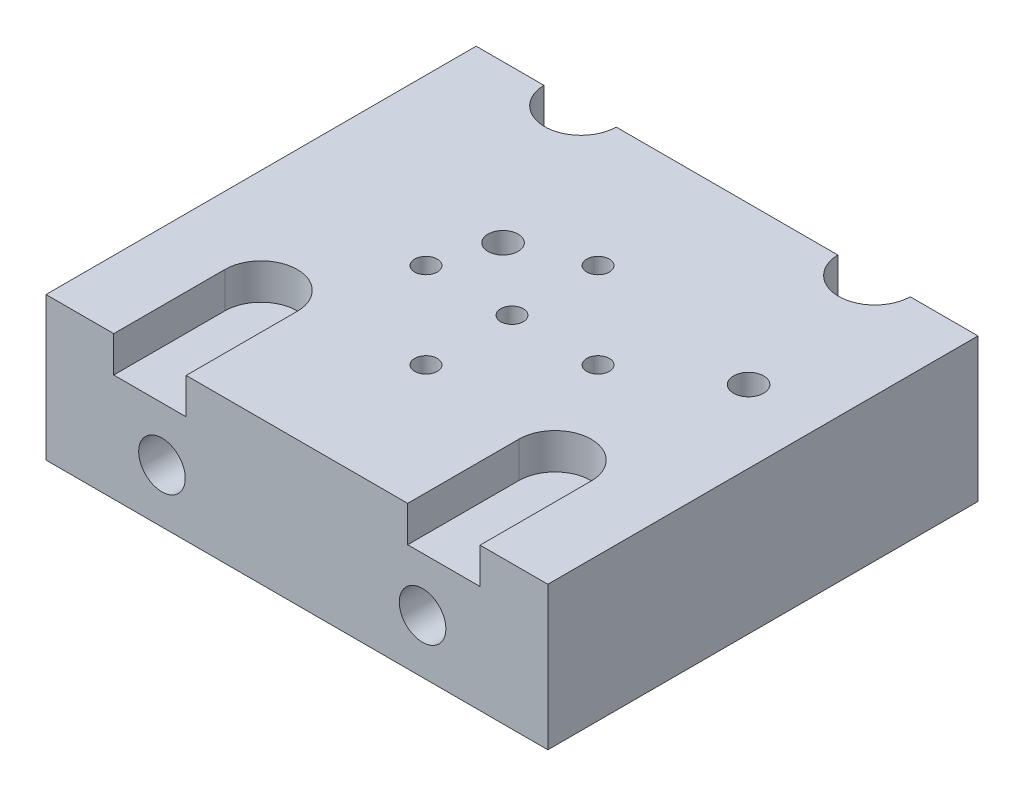
ISO-10303-21;
HEADER;
FILE_DESCRIPTION(('STEP AP214'),'2;1');
FILE_NAME('part.step','',(''),(''),'','','');
FILE_SCHEMA(('AUTOMOTIVE_DESIGN { 1 0 10303 214 1 1 1 1 }'));
ENDSEC;
DATA;
#1=APPLICATION_CONTEXT('core data for automotive mechanical design processes');
#2=APPLICATION_PROTOCOL_DEFINITION('international standard','automotive_design',2000,#1);
#3=PRODUCT_CONTEXT('',#1,'mechanical');
#4=PRODUCT('Part','Part','',(#3));
#5=PRODUCT_RELATED_PRODUCT_CATEGORY('part','',(#4));
#6=PRODUCT_DEFINITION_FORMATION('','',#4);
#7=PRODUCT_DEFINITION_CONTEXT('part definition',#1,'design');
#8=PRODUCT_DEFINITION('design','',#6,#7);
#9=PRODUCT_DEFINITION_SHAPE('','',#8);
#10=(LENGTH_UNIT() NAMED_UNIT(*) SI_UNIT(.MILLI.,.METRE.));
#11=(NAMED_UNIT(*) PLANE_ANGLE_UNIT() SI_UNIT($,.RADIAN.));
#12=(NAMED_UNIT(*) SI_UNIT($,.STERADIAN.) SOLID_ANGLE_UNIT());
#13=UNCERTAINTY_MEASURE_WITH_UNIT(LENGTH_MEASURE(1.E-05),#10,'distance_accuracy_value','');
#14=(GEOMETRIC_REPRESENTATION_CONTEXT(3) GLOBAL_UNCERTAINTY_ASSIGNED_CONTEXT((#13)) GLOBAL_UNIT_ASSIGNED_CONTEXT((#10,
#11,#12)) REPRESENTATION_CONTEXT('',''));
#15=CARTESIAN_POINT('',(0.,0.,0.));
#16=DIRECTION('',(0.,0.,1.));
#17=DIRECTION('',(1.,0.,0.));
#18=AXIS2_PLACEMENT_3D('',#15,#16,#17);
#19=CARTESIAN_POINT('',(35.,0.,30.));
#20=DIRECTION('',(0.,1.,0.));
#21=DIRECTION('',(0.,0.,1.));
#22=AXIS2_PLACEMENT_3D('',#19,#20,#21);
#23=CYLINDRICAL_SURFACE('',#22,1.575);
#24=CARTESIAN_POINT('',(35.,20.,30.));
#25=DIRECTION('',(0.,1.,0.));
#26=DIRECTION('',(0.,0.,1.));
#27=AXIS2_PLACEMENT_3D('',#24,#25,#26);
#28=CIRCLE('',#27,1.575);
#29=CARTESIAN_POINT('',(35.,20.,31.575));
#30=VERTEX_POINT('',#29);
#31=EDGE_CURVE('E296',#30,#30,#28,.T.);
#32=ORIENTED_EDGE('',*,*,#31,.T.);
#33=EDGE_LOOP('',(#32));
#34=FACE_BOUND('',#33,.T.);
#35=CARTESIAN_POINT('',(35.,3.,30.));
#36=DIRECTION('',(0.,-1.,0.));
#37=DIRECTION('',(0.,0.,-1.));
#38=AXIS2_PLACEMENT_3D('',#35,#36,#37);
#39=CIRCLE('',#38,1.575);
#40=CARTESIAN_POINT('',(35.,3.,28.425));
#41=VERTEX_POINT('',#40);
#42=EDGE_CURVE('E274',#41,#41,#39,.F.);
#43=ORIENTED_EDGE('',*,*,#42,.F.);
#44=EDGE_LOOP('',(#43));
#45=FACE_BOUND('',#44,.T.);
#46=ADVANCED_FACE('F47',(#34,#45),#23,.F.);
#47=CARTESIAN_POINT('',(23.,0.,30.));
#48=DIRECTION('',(0.,1.,0.));
#49=DIRECTION('',(0.,0.,1.));
#50=AXIS2_PLACEMENT_3D('',#47,#48,#49);
#51=CYLINDRICAL_SURFACE('',#50,1.575);
#52=CARTESIAN_POINT('',(23.,20.,30.));
#53=DIRECTION('',(0.,1.,0.));
#54=DIRECTION('',(0.,0.,1.));
#55=AXIS2_PLACEMENT_3D('',#52,#53,#54);
#56=CIRCLE('',#55,1.575);
#57=CARTESIAN_POINT('',(23.,20.,31.575));
#58=VERTEX_POINT('',#57);
#59=EDGE_CURVE('E278',#58,#58,#56,.T.);
#60=ORIENTED_EDGE('',*,*,#59,.T.);
#61=EDGE_LOOP('',(#60));
#62=FACE_BOUND('',#61,.T.);
#63=CARTESIAN_POINT('',(23.,3.,30.));
#64=DIRECTION('',(0.,-1.,0.));
#65=DIRECTION('',(0.,0.,-1.));
#66=AXIS2_PLACEMENT_3D('',#63,#64,#65);
#67=CIRCLE('',#66,1.575);
#68=CARTESIAN_POINT('',(23.,3.,28.425));
#69=VERTEX_POINT('',#68);
#70=EDGE_CURVE('E345',#69,#69,#67,.F.);
#71=ORIENTED_EDGE('',*,*,#70,.F.);
#72=EDGE_LOOP('',(#71));
#73=FACE_BOUND('',#72,.T.);
#74=ADVANCED_FACE('F424',(#62,#73),#51,.F.);
#75=CARTESIAN_POINT('',(35.,0.,42.));
#76=DIRECTION('',(0.,1.,0.));
#77=DIRECTION('',(0.,0.,1.));
#78=AXIS2_PLACEMENT_3D('',#75,#76,#77);
#79=CYLINDRICAL_SURFACE('',#78,1.57499999999999);
#80=CARTESIAN_POINT('',(35.,20.,42.));
#81=DIRECTION('',(0.,1.,0.));
#82=DIRECTION('',(0.,0.,1.));
#83=AXIS2_PLACEMENT_3D('',#80,#81,#82);
#84=CIRCLE('',#83,1.57499999999999);
#85=CARTESIAN_POINT('',(35.,20.,43.575));
#86=VERTEX_POINT('',#85);
#87=EDGE_CURVE('E287',#86,#86,#84,.T.);
#88=ORIENTED_EDGE('',*,*,#87,.T.);
#89=EDGE_LOOP('',(#88));
#90=FACE_BOUND('',#89,.T.);
#91=CARTESIAN_POINT('',(35.,3.,42.));
#92=DIRECTION('',(0.,-1.,0.));
#93=DIRECTION('',(0.,0.,-1.));
#94=AXIS2_PLACEMENT_3D('',#91,#92,#93);
#95=CIRCLE('',#94,1.57499999999999);
#96=CARTESIAN_POINT('',(35.,3.,40.425));
#97=VERTEX_POINT('',#96);
#98=EDGE_CURVE('E342',#97,#97,#95,.F.);
#99=ORIENTED_EDGE('',*,*,#98,.F.);
#100=EDGE_LOOP('',(#99));
#101=FACE_BOUND('',#100,.T.);
#102=ADVANCED_FACE('F431',(#90,#101),#79,.F.);
#103=CARTESIAN_POINT('',(47.,0.,30.));
#104=DIRECTION('',(0.,1.,0.));
#105=DIRECTION('',(0.,0.,1.));
#106=AXIS2_PLACEMENT_3D('',#103,#104,#105);
#107=CYLINDRICAL_SURFACE('',#106,1.575);
#108=CARTESIAN_POINT('',(47.,20.,30.));
#109=DIRECTION('',(0.,1.,0.));
#110=DIRECTION('',(0.,0.,1.));
#111=AXIS2_PLACEMENT_3D('',#108,#109,#110);
#112=CIRCLE('',#111,1.575);
#113=CARTESIAN_POINT('',(47.,20.,31.575));
#114=VERTEX_POINT('',#113);
#115=EDGE_CURVE('E290',#114,#114,#112,.T.);
#116=ORIENTED_EDGE('',*,*,#115,.T.);
#117=EDGE_LOOP('',(#116));
#118=FACE_BOUND('',#117,.T.);
#119=CARTESIAN_POINT('',(47.,3.,30.));
#120=DIRECTION('',(0.,-1.,0.));
#121=DIRECTION('',(0.,0.,-1.));
#122=AXIS2_PLACEMENT_3D('',#119,#120,#121);
#123=CIRCLE('',#122,1.575);
#124=CARTESIAN_POINT('',(47.,3.,28.425));
#125=VERTEX_POINT('',#124);
#126=EDGE_CURVE('E339',#125,#125,#123,.F.);
#127=ORIENTED_EDGE('',*,*,#126,.F.);
#128=EDGE_LOOP('',(#127));
#129=FACE_BOUND('',#128,.T.);
#130=ADVANCED_FACE('F437',(#118,#129),#107,.F.);
#131=CARTESIAN_POINT('',(35.,0.,18.));
#132=DIRECTION('',(0.,1.,0.));
#133=DIRECTION('',(0.,0.,1.));
#134=AXIS2_PLACEMENT_3D('',#131,#132,#133);
#135=CYLINDRICAL_SURFACE('',#134,1.575);
#136=CARTESIAN_POINT('',(35.,20.,18.));
#137=DIRECTION('',(0.,1.,0.));
#138=DIRECTION('',(0.,0.,1.));
#139=AXIS2_PLACEMENT_3D('',#136,#137,#138);
#140=CIRCLE('',#139,1.575);
#141=CARTESIAN_POINT('',(35.,20.,19.575));
#142=VERTEX_POINT('',#141);
#143=EDGE_CURVE('E293',#142,#142,#140,.T.);
#144=ORIENTED_EDGE('',*,*,#143,.T.);
#145=EDGE_LOOP('',(#144));
#146=FACE_BOUND('',#145,.T.);
#147=CARTESIAN_POINT('',(35.,3.,18.));
#148=DIRECTION('',(0.,-1.,0.));
#149=DIRECTION('',(0.,0.,-1.));
#150=AXIS2_PLACEMENT_3D('',#147,#148,#149);
#151=CIRCLE('',#150,1.575);
#152=CARTESIAN_POINT('',(35.,3.,16.425));
#153=VERTEX_POINT('',#152);
#154=EDGE_CURVE('E240',#153,#153,#151,.F.);
#155=ORIENTED_EDGE('',*,*,#154,.F.);
#156=EDGE_LOOP('',(#155));
#157=FACE_BOUND('',#156,.T.);
#158=ADVANCED_FACE('F455',(#146,#157),#135,.F.);
#159=CARTESIAN_POINT('',(0.,20.,0.));
#160=DIRECTION('',(1.,0.,0.));
#161=DIRECTION('',(0.,0.,-1.));
#162=AXIS2_PLACEMENT_3D('',#159,#160,#161);
#163=PLANE('',#162);
#164=DIRECTION('',(0.,0.,1.));
#165=VECTOR('',#164,1.);
#166=CARTESIAN_POINT('',(0.,0.,0.));
#167=LINE('',#166,#165);
#168=CARTESIAN_POINT('',(0.,0.,0.));
#169=VERTEX_POINT('',#168);
#170=CARTESIAN_POINT('',(0.,0.,60.));
#171=VERTEX_POINT('',#170);
#172=EDGE_CURVE('E301',#169,#171,#167,.T.);
#173=ORIENTED_EDGE('',*,*,#172,.T.);
#174=DIRECTION('',(0.,-1.,0.));
#175=VECTOR('',#174,1.);
#176=CARTESIAN_POINT('',(0.,20.,60.));
#177=LINE('',#176,#175);
#178=CARTESIAN_POINT('',(0.,20.,60.));
#179=VERTEX_POINT('',#178);
#180=EDGE_CURVE('E333',#179,#171,#177,.T.);
#181=ORIENTED_EDGE('',*,*,#180,.F.);
#182=DIRECTION('',(0.,0.,1.));
#183=VECTOR('',#182,1.);
#184=CARTESIAN_POINT('',(0.,20.,0.));
#185=LINE('',#184,#183);
#186=CARTESIAN_POINT('',(0.,20.,0.));
#187=VERTEX_POINT('',#186);
#188=EDGE_CURVE('E302',#187,#179,#185,.T.);
#189=ORIENTED_EDGE('',*,*,#188,.F.);
#190=DIRECTION('',(0.,-1.,0.));
#191=VECTOR('',#190,1.);
#192=CARTESIAN_POINT('',(0.,20.,0.));
#193=LINE('',#192,#191);
#194=EDGE_CURVE('E316',#187,#169,#193,.T.);
#195=ORIENTED_EDGE('',*,*,#194,.T.);
#196=EDGE_LOOP('',(#173,#181,#189,#195));
#197=FACE_BOUND('',#196,.T.);
#198=ADVANCED_FACE('F404',(#197),#163,.F.);
#199=CARTESIAN_POINT('',(0.,20.,60.));
#200=DIRECTION('',(0.,0.,-1.));
#201=DIRECTION('',(-1.,0.,0.));
#202=AXIS2_PLACEMENT_3D('',#199,#200,#201);
#203=PLANE('',#202);
#204=CARTESIAN_POINT('',(52.525,7.5,60.));
#205=DIRECTION('',(0.,0.,-1.));
#206=DIRECTION('',(-1.,0.,0.));
#207=AXIS2_PLACEMENT_3D('',#204,#205,#206);
#208=CIRCLE('',#207,3.25);
#209=CARTESIAN_POINT('',(49.275,7.5,60.));
#210=VERTEX_POINT('',#209);
#211=EDGE_CURVE('E267',#210,#210,#208,.T.);
#212=ORIENTED_EDGE('',*,*,#211,.T.);
#213=EDGE_LOOP('',(#212));
#214=FACE_BOUND('',#213,.T.);
#215=CARTESIAN_POINT('',(16.175,7.5,60.));
#216=DIRECTION('',(0.,0.,-1.));
#217=DIRECTION('',(-1.,0.,0.));
#218=AXIS2_PLACEMENT_3D('',#215,#216,#217);
#219=CIRCLE('',#218,3.25);
#220=CARTESIAN_POINT('',(12.925,7.5,60.));
#221=VERTEX_POINT('',#220);
#222=EDGE_CURVE('E271',#221,#221,#219,.T.);
#223=ORIENTED_EDGE('',*,*,#222,.T.);
#224=EDGE_LOOP('',(#223));
#225=FACE_BOUND('',#224,.T.);
#226=DIRECTION('',(-1.,0.,0.));
#227=VECTOR('',#226,1.);
#228=CARTESIAN_POINT('',(0.,15.,60.));
#229=LINE('',#228,#227);
#230=CARTESIAN_POINT('',(60.55,15.,60.));
#231=VERTEX_POINT('',#230);
#232=CARTESIAN_POINT('',(50.45,15.,60.));
#233=VERTEX_POINT('',#232);
#234=EDGE_CURVE('E12',#231,#233,#229,.T.);
#235=ORIENTED_EDGE('',*,*,#234,.T.);
#236=DIRECTION('',(0.,1.,0.));
#237=VECTOR('',#236,1.);
#238=CARTESIAN_POINT('',(50.45,20.,60.));
#239=LINE('',#238,#237);
#240=CARTESIAN_POINT('',(50.45,20.,60.));
#241=VERTEX_POINT('',#240);
#242=EDGE_CURVE('E230',#233,#241,#239,.T.);
#243=ORIENTED_EDGE('',*,*,#242,.T.);
#244=DIRECTION('',(1.,0.,0.));
#245=VECTOR('',#244,1.);
#246=CARTESIAN_POINT('',(0.,20.,60.));
#247=LINE('',#246,#245);
#248=CARTESIAN_POINT('',(19.55,20.,60.));
#249=VERTEX_POINT('',#248);
#250=EDGE_CURVE('E190',#249,#241,#247,.T.);
#251=ORIENTED_EDGE('',*,*,#250,.F.);
#252=DIRECTION('',(0.,-1.,0.));
#253=VECTOR('',#252,1.);
#254=CARTESIAN_POINT('',(19.55,20.,60.));
#255=LINE('',#254,#253);
#256=CARTESIAN_POINT('',(19.55,15.,60.));
#257=VERTEX_POINT('',#256);
#258=EDGE_CURVE('E215',#249,#257,#255,.T.);
#259=ORIENTED_EDGE('',*,*,#258,.T.);
#260=DIRECTION('',(1.,0.,0.));
#261=VECTOR('',#260,1.);
#262=CARTESIAN_POINT('',(0.,15.,60.));
#263=LINE('',#262,#261);
#264=CARTESIAN_POINT('',(9.45000000000001,15.,60.));
#265=VERTEX_POINT('',#264);
#266=EDGE_CURVE('E56',#265,#257,#263,.T.);
#267=ORIENTED_EDGE('',*,*,#266,.F.);
#268=DIRECTION('',(0.,1.,0.));
#269=VECTOR('',#268,1.);
#270=CARTESIAN_POINT('',(9.45000000000001,20.,60.));
#271=LINE('',#270,#269);
#272=CARTESIAN_POINT('',(9.45000000000001,20.,60.));
#273=VERTEX_POINT('',#272);
#274=EDGE_CURVE('E220',#265,#273,#271,.T.);
#275=ORIENTED_EDGE('',*,*,#274,.T.);
#276=EDGE_CURVE('E307',#179,#273,#247,.T.);
#277=ORIENTED_EDGE('',*,*,#276,.F.);
#278=ORIENTED_EDGE('',*,*,#180,.T.);
#279=DIRECTION('',(1.,0.,0.));
#280=VECTOR('',#279,1.);
#281=CARTESIAN_POINT('',(0.,0.,60.));
#282=LINE('',#281,#280);
#283=CARTESIAN_POINT('',(70.,0.,60.));
#284=VERTEX_POINT('',#283);
#285=EDGE_CURVE('E320',#171,#284,#282,.T.);
#286=ORIENTED_EDGE('',*,*,#285,.T.);
#287=DIRECTION('',(0.,-1.,0.));
#288=VECTOR('',#287,1.);
#289=CARTESIAN_POINT('',(70.,20.,60.));
#290=LINE('',#289,#288);
#291=CARTESIAN_POINT('',(70.,20.,60.));
#292=VERTEX_POINT('',#291);
#293=EDGE_CURVE('E330',#292,#284,#290,.T.);
#294=ORIENTED_EDGE('',*,*,#293,.F.);
#295=CARTESIAN_POINT('',(60.55,20.,60.));
#296=VERTEX_POINT('',#295);
#297=EDGE_CURVE('E305',#296,#292,#247,.T.);
#298=ORIENTED_EDGE('',*,*,#297,.F.);
#299=DIRECTION('',(0.,-1.,0.));
#300=VECTOR('',#299,1.);
#301=CARTESIAN_POINT('',(60.55,20.,60.));
#302=LINE('',#301,#300);
#303=EDGE_CURVE('E227',#296,#231,#302,.T.);
#304=ORIENTED_EDGE('',*,*,#303,.T.);
#305=EDGE_LOOP('',(#235,#243,#251,#259,#267,#275,#277,#278,#286,#294,#298,#304));
#306=FACE_BOUND('',#305,.T.);
#307=ADVANCED_FACE('F381',(#214,#225,#306),#203,.F.);
#308=CARTESIAN_POINT('',(70.,20.,0.));
#309=DIRECTION('',(-1.,0.,0.));
#310=DIRECTION('',(0.,0.,1.));
#311=AXIS2_PLACEMENT_3D('',#308,#309,#310);
#312=PLANE('',#311);
#313=DIRECTION('',(0.,0.,-1.));
#314=VECTOR('',#313,1.);
#315=CARTESIAN_POINT('',(70.,0.,0.));
#316=LINE('',#315,#314);
#317=CARTESIAN_POINT('',(70.,0.,0.));
#318=VERTEX_POINT('',#317);
#319=EDGE_CURVE('E322',#284,#318,#316,.T.);
#320=ORIENTED_EDGE('',*,*,#319,.T.);
#321=DIRECTION('',(0.,-1.,0.));
#322=VECTOR('',#321,1.);
#323=CARTESIAN_POINT('',(70.,20.,0.));
#324=LINE('',#323,#322);
#325=CARTESIAN_POINT('',(70.,20.,0.));
#326=VERTEX_POINT('',#325);
#327=EDGE_CURVE('E327',#326,#318,#324,.T.);
#328=ORIENTED_EDGE('',*,*,#327,.F.);
#329=DIRECTION('',(0.,0.,-1.));
#330=VECTOR('',#329,1.);
#331=CARTESIAN_POINT('',(70.,20.,0.));
#332=LINE('',#331,#330);
#333=EDGE_CURVE('E310',#292,#326,#332,.T.);
#334=ORIENTED_EDGE('',*,*,#333,.F.);
#335=ORIENTED_EDGE('',*,*,#293,.T.);
#336=EDGE_LOOP('',(#320,#328,#334,#335));
#337=FACE_BOUND('',#336,.T.);
#338=ADVANCED_FACE('F388',(#337),#312,.F.);
#339=CARTESIAN_POINT('',(0.,20.,0.));
#340=DIRECTION('',(0.,0.,1.));
#341=DIRECTION('',(1.,0.,0.));
#342=AXIS2_PLACEMENT_3D('',#339,#340,#341);
#343=PLANE('',#342);
#344=CARTESIAN_POINT('',(52.525,7.5,0.));
#345=DIRECTION('',(0.,0.,1.));
#346=DIRECTION('',(1.,0.,0.));
#347=AXIS2_PLACEMENT_3D('',#344,#345,#346);
#348=CIRCLE('',#347,4.05);
#349=CARTESIAN_POINT('',(56.575,7.5,0.));
#350=VERTEX_POINT('',#349);
#351=EDGE_CURVE('E355',#350,#350,#348,.T.);
#352=ORIENTED_EDGE('',*,*,#351,.T.);
#353=EDGE_LOOP('',(#352));
#354=FACE_BOUND('',#353,.T.);
#355=CARTESIAN_POINT('',(16.175,7.5,0.));
#356=DIRECTION('',(0.,0.,1.));
#357=DIRECTION('',(1.,0.,0.));
#358=AXIS2_PLACEMENT_3D('',#355,#356,#357);
#359=CIRCLE('',#358,4.05);
#360=CARTESIAN_POINT('',(20.225,7.5,0.));
#361=VERTEX_POINT('',#360);
#362=EDGE_CURVE('E352',#361,#361,#359,.T.);
#363=ORIENTED_EDGE('',*,*,#362,.T.);
#364=EDGE_LOOP('',(#363));
#365=FACE_BOUND('',#364,.T.);
#366=DIRECTION('',(-1.,0.,0.));
#367=VECTOR('',#366,1.);
#368=CARTESIAN_POINT('',(0.,15.,0.));
#369=LINE('',#368,#367);
#370=CARTESIAN_POINT('',(19.5489093426721,15.,0.));
#371=VERTEX_POINT('',#370);
#372=CARTESIAN_POINT('',(9.45109065732797,15.,0.));
#373=VERTEX_POINT('',#372);
#374=EDGE_CURVE('E370',#371,#373,#369,.T.);
#375=ORIENTED_EDGE('',*,*,#374,.F.);
#376=DIRECTION('',(0.,1.,0.));
#377=VECTOR('',#376,1.);
#378=CARTESIAN_POINT('',(19.5489093426721,15.,0.));
#379=LINE('',#378,#377);
#380=CARTESIAN_POINT('',(19.5489093426721,20.,0.));
#381=VERTEX_POINT('',#380);
#382=EDGE_CURVE('E233',#371,#381,#379,.T.);
#383=ORIENTED_EDGE('',*,*,#382,.T.);
#384=DIRECTION('',(-1.,0.,0.));
#385=VECTOR('',#384,1.);
#386=CARTESIAN_POINT('',(0.,20.,0.));
#387=LINE('',#386,#385);
#388=CARTESIAN_POINT('',(50.451090657328,20.,0.));
#389=VERTEX_POINT('',#388);
#390=EDGE_CURVE('E317',#389,#381,#387,.T.);
#391=ORIENTED_EDGE('',*,*,#390,.F.);
#392=DIRECTION('',(0.,1.,0.));
#393=VECTOR('',#392,1.);
#394=CARTESIAN_POINT('',(50.451090657328,15.,0.));
#395=LINE('',#394,#393);
#396=CARTESIAN_POINT('',(50.451090657328,15.,0.));
#397=VERTEX_POINT('',#396);
#398=EDGE_CURVE('E71',#389,#397,#395,.F.);
#399=ORIENTED_EDGE('',*,*,#398,.T.);
#400=DIRECTION('',(1.,0.,0.));
#401=VECTOR('',#400,1.);
#402=CARTESIAN_POINT('',(0.,15.,0.));
#403=LINE('',#402,#401);
#404=CARTESIAN_POINT('',(60.548909342672,15.,0.));
#405=VERTEX_POINT('',#404);
#406=EDGE_CURVE('E367',#397,#405,#403,.T.);
#407=ORIENTED_EDGE('',*,*,#406,.T.);
#408=DIRECTION('',(0.,1.,0.));
#409=VECTOR('',#408,1.);
#410=CARTESIAN_POINT('',(60.548909342672,15.,0.));
#411=LINE('',#410,#409);
#412=CARTESIAN_POINT('',(60.548909342672,20.,0.));
#413=VERTEX_POINT('',#412);
#414=EDGE_CURVE('E224',#405,#413,#411,.T.);
#415=ORIENTED_EDGE('',*,*,#414,.T.);
#416=EDGE_CURVE('E313',#326,#413,#387,.T.);
#417=ORIENTED_EDGE('',*,*,#416,.F.);
#418=ORIENTED_EDGE('',*,*,#327,.T.);
#419=DIRECTION('',(-1.,0.,0.));
#420=VECTOR('',#419,1.);
#421=CARTESIAN_POINT('',(0.,0.,0.));
#422=LINE('',#421,#420);
#423=EDGE_CURVE('E306',#318,#169,#422,.T.);
#424=ORIENTED_EDGE('',*,*,#423,.T.);
#425=ORIENTED_EDGE('',*,*,#194,.F.);
#426=CARTESIAN_POINT('',(9.45109065732797,20.,0.));
#427=VERTEX_POINT('',#426);
#428=EDGE_CURVE('E312',#427,#187,#387,.T.);
#429=ORIENTED_EDGE('',*,*,#428,.F.);
#430=DIRECTION('',(0.,1.,0.));
#431=VECTOR('',#430,1.);
#432=CARTESIAN_POINT('',(9.45109065732797,15.,0.));
#433=LINE('',#432,#431);
#434=EDGE_CURVE('E63',#427,#373,#433,.F.);
#435=ORIENTED_EDGE('',*,*,#434,.T.);
#436=EDGE_LOOP('',(#375,#383,#391,#399,#407,#415,#417,#418,#424,#425,#429,#435));
#437=FACE_BOUND('',#436,.T.);
#438=ADVANCED_FACE('F393',(#354,#365,#437),#343,.F.);
#439=CARTESIAN_POINT('',(0.,20.,0.));
#440=DIRECTION('',(0.,1.,0.));
#441=DIRECTION('',(0.,0.,1.));
#442=AXIS2_PLACEMENT_3D('',#439,#440,#441);
#443=PLANE('',#442);
#444=CARTESIAN_POINT('',(14.5,20.,-0.104949747398012));
#445=DIRECTION('',(0.,1.,0.));
#446=DIRECTION('',(0.,0.,1.));
#447=AXIS2_PLACEMENT_3D('',#444,#445,#446);
#448=CIRCLE('',#447,5.05);
#449=EDGE_CURVE('E365',#427,#381,#448,.T.);
#450=ORIENTED_EDGE('',*,*,#449,.F.);
#451=ORIENTED_EDGE('',*,*,#428,.T.);
#452=ORIENTED_EDGE('',*,*,#188,.T.);
#453=ORIENTED_EDGE('',*,*,#276,.T.);
#454=DIRECTION('',(0.,0.,1.));
#455=VECTOR('',#454,1.);
#456=CARTESIAN_POINT('',(9.45000000000001,20.,60.104949747398));
#457=LINE('',#456,#455);
#458=CARTESIAN_POINT('',(9.45000000000001,20.,44.5));
#459=VERTEX_POINT('',#458);
#460=EDGE_CURVE('E202',#459,#273,#457,.T.);
#461=ORIENTED_EDGE('',*,*,#460,.F.);
#462=CARTESIAN_POINT('',(14.5,20.,44.5));
#463=DIRECTION('',(0.,1.,0.));
#464=DIRECTION('',(0.,0.,1.));
#465=AXIS2_PLACEMENT_3D('',#462,#463,#464);
#466=CIRCLE('',#465,5.05);
#467=CARTESIAN_POINT('',(19.55,20.,44.5));
#468=VERTEX_POINT('',#467);
#469=EDGE_CURVE('E209',#468,#459,#466,.T.);
#470=ORIENTED_EDGE('',*,*,#469,.F.);
#471=DIRECTION('',(0.,0.,-1.));
#472=VECTOR('',#471,1.);
#473=CARTESIAN_POINT('',(19.5500000000001,20.,0.));
#474=LINE('',#473,#472);
#475=EDGE_CURVE('E361',#249,#468,#474,.T.);
#476=ORIENTED_EDGE('',*,*,#475,.F.);
#477=ORIENTED_EDGE('',*,*,#250,.T.);
#478=DIRECTION('',(0.,0.,1.));
#479=VECTOR('',#478,1.);
#480=CARTESIAN_POINT('',(50.45,20.,60.104949747398));
#481=LINE('',#480,#479);
#482=CARTESIAN_POINT('',(50.45,20.,44.5));
#483=VERTEX_POINT('',#482);
#484=EDGE_CURVE('E166',#483,#241,#481,.T.);
#485=ORIENTED_EDGE('',*,*,#484,.F.);
#486=CARTESIAN_POINT('',(55.5,20.,44.5));
#487=DIRECTION('',(0.,1.,0.));
#488=DIRECTION('',(0.,0.,-1.));
#489=AXIS2_PLACEMENT_3D('',#486,#487,#488);
#490=CIRCLE('',#489,5.05);
#491=CARTESIAN_POINT('',(60.55,20.,44.5));
#492=VERTEX_POINT('',#491);
#493=EDGE_CURVE('E178',#492,#483,#490,.T.);
#494=ORIENTED_EDGE('',*,*,#493,.F.);
#495=DIRECTION('',(0.,0.,-1.));
#496=VECTOR('',#495,1.);
#497=CARTESIAN_POINT('',(60.55,20.,0.));
#498=LINE('',#497,#496);
#499=EDGE_CURVE('E363',#296,#492,#498,.T.);
#500=ORIENTED_EDGE('',*,*,#499,.F.);
#501=ORIENTED_EDGE('',*,*,#297,.T.);
#502=ORIENTED_EDGE('',*,*,#333,.T.);
#503=ORIENTED_EDGE('',*,*,#416,.T.);
#504=CARTESIAN_POINT('',(55.5,20.,-0.104949747398012));
#505=DIRECTION('',(0.,1.,0.));
#506=DIRECTION('',(0.,0.,-1.));
#507=AXIS2_PLACEMENT_3D('',#504,#505,#506);
#508=CIRCLE('',#507,5.04999999999999);
#509=EDGE_CURVE('E174',#389,#413,#508,.T.);
#510=ORIENTED_EDGE('',*,*,#509,.F.);
#511=ORIENTED_EDGE('',*,*,#390,.T.);
#512=EDGE_LOOP('',(#450,#451,#452,#453,#461,#470,#476,#477,#485,#494,#500,#501,#502,#503,#510,#511));
#513=FACE_BOUND('',#512,.T.);
#514=CARTESIAN_POINT('',(59.875,20.,21.875));
#515=DIRECTION('',(0.,-1.,0.));
#516=DIRECTION('',(0.,0.,-1.));
#517=AXIS2_PLACEMENT_3D('',#514,#515,#516);
#518=CIRCLE('',#517,2.1);
#519=CARTESIAN_POINT('',(59.875,20.,19.775));
#520=VERTEX_POINT('',#519);
#521=EDGE_CURVE('E275',#520,#520,#518,.T.);
#522=ORIENTED_EDGE('',*,*,#521,.T.);
#523=EDGE_LOOP('',(#522));
#524=FACE_BOUND('',#523,.T.);
#525=CARTESIAN_POINT('',(25.625,20.,21.875));
#526=DIRECTION('',(0.,-1.,0.));
#527=DIRECTION('',(0.,0.,-1.));
#528=AXIS2_PLACEMENT_3D('',#525,#526,#527);
#529=CIRCLE('',#528,2.09999999999999);
#530=CARTESIAN_POINT('',(25.625,20.,19.775));
#531=VERTEX_POINT('',#530);
#532=EDGE_CURVE('E270',#531,#531,#529,.T.);
#533=ORIENTED_EDGE('',*,*,#532,.T.);
#534=EDGE_LOOP('',(#533));
#535=FACE_BOUND('',#534,.T.);
#536=ORIENTED_EDGE('',*,*,#143,.F.);
#537=EDGE_LOOP('',(#536));
#538=FACE_BOUND('',#537,.T.);
#539=ORIENTED_EDGE('',*,*,#115,.F.);
#540=EDGE_LOOP('',(#539));
#541=FACE_BOUND('',#540,.T.);
#542=ORIENTED_EDGE('',*,*,#87,.F.);
#543=EDGE_LOOP('',(#542));
#544=FACE_BOUND('',#543,.T.);
#545=ORIENTED_EDGE('',*,*,#59,.F.);
#546=EDGE_LOOP('',(#545));
#547=FACE_BOUND('',#546,.T.);
#548=ORIENTED_EDGE('',*,*,#31,.F.);
#549=EDGE_LOOP('',(#548));
#550=FACE_BOUND('',#549,.T.);
#551=ADVANCED_FACE('F186',(#513,#524,#535,#538,#541,#544,#547,#550),#443,.T.);
#552=CARTESIAN_POINT('',(0.,0.,0.));
#553=DIRECTION('',(0.,1.,0.));
#554=DIRECTION('',(0.,0.,1.));
#555=AXIS2_PLACEMENT_3D('',#552,#553,#554);
#556=PLANE('',#555);
#557=CARTESIAN_POINT('',(35.,0.,42.));
#558=DIRECTION('',(0.,-1.,0.));
#559=DIRECTION('',(0.,0.,-1.));
#560=AXIS2_PLACEMENT_3D('',#557,#558,#559);
#561=CIRCLE('',#560,2.99999999999999);
#562=CARTESIAN_POINT('',(35.,0.,39.));
#563=VERTEX_POINT('',#562);
#564=EDGE_CURVE('E241',#563,#563,#561,.T.);
#565=ORIENTED_EDGE('',*,*,#564,.F.);
#566=EDGE_LOOP('',(#565));
#567=FACE_BOUND('',#566,.T.);
#568=CARTESIAN_POINT('',(35.,0.,18.));
#569=DIRECTION('',(0.,-1.,0.));
#570=DIRECTION('',(0.,0.,-1.));
#571=AXIS2_PLACEMENT_3D('',#568,#569,#570);
#572=CIRCLE('',#571,2.99999999999999);
#573=CARTESIAN_POINT('',(35.,0.,15.));
#574=VERTEX_POINT('',#573);
#575=EDGE_CURVE('E252',#574,#574,#572,.T.);
#576=ORIENTED_EDGE('',*,*,#575,.F.);
#577=EDGE_LOOP('',(#576));
#578=FACE_BOUND('',#577,.T.);
#579=CARTESIAN_POINT('',(47.,0.,30.));
#580=DIRECTION('',(0.,-1.,0.));
#581=DIRECTION('',(0.,0.,-1.));
#582=AXIS2_PLACEMENT_3D('',#579,#580,#581);
#583=CIRCLE('',#582,2.99999999999999);
#584=CARTESIAN_POINT('',(47.,0.,27.));
#585=VERTEX_POINT('',#584);
#586=EDGE_CURVE('E245',#585,#585,#583,.T.);
#587=ORIENTED_EDGE('',*,*,#586,.F.);
#588=EDGE_LOOP('',(#587));
#589=FACE_BOUND('',#588,.T.);
#590=CARTESIAN_POINT('',(35.,0.,30.));
#591=DIRECTION('',(0.,-1.,0.));
#592=DIRECTION('',(0.,0.,-1.));
#593=AXIS2_PLACEMENT_3D('',#590,#591,#592);
#594=CIRCLE('',#593,2.99999999999999);
#595=CARTESIAN_POINT('',(35.,0.,27.));
#596=VERTEX_POINT('',#595);
#597=EDGE_CURVE('E262',#596,#596,#594,.T.);
#598=ORIENTED_EDGE('',*,*,#597,.F.);
#599=EDGE_LOOP('',(#598));
#600=FACE_BOUND('',#599,.T.);
#601=CARTESIAN_POINT('',(23.,0.,30.));
#602=DIRECTION('',(0.,-1.,0.));
#603=DIRECTION('',(0.,0.,-1.));
#604=AXIS2_PLACEMENT_3D('',#601,#602,#603);
#605=CIRCLE('',#604,3.);
#606=CARTESIAN_POINT('',(23.,0.,27.));
#607=VERTEX_POINT('',#606);
#608=EDGE_CURVE('E244',#607,#607,#605,.T.);
#609=ORIENTED_EDGE('',*,*,#608,.F.);
#610=EDGE_LOOP('',(#609));
#611=FACE_BOUND('',#610,.T.);
#612=CARTESIAN_POINT('',(59.875,0.,21.875));
#613=DIRECTION('',(0.,-1.,0.));
#614=DIRECTION('',(0.,0.,-1.));
#615=AXIS2_PLACEMENT_3D('',#612,#613,#614);
#616=CIRCLE('',#615,2.1);
#617=CARTESIAN_POINT('',(59.875,0.,19.775));
#618=VERTEX_POINT('',#617);
#619=EDGE_CURVE('E279',#618,#618,#616,.T.);
#620=ORIENTED_EDGE('',*,*,#619,.F.);
#621=EDGE_LOOP('',(#620));
#622=FACE_BOUND('',#621,.T.);
#623=CARTESIAN_POINT('',(25.625,0.,21.875));
#624=DIRECTION('',(0.,-1.,0.));
#625=DIRECTION('',(0.,0.,-1.));
#626=AXIS2_PLACEMENT_3D('',#623,#624,#625);
#627=CIRCLE('',#626,2.09999999999999);
#628=CARTESIAN_POINT('',(25.625,0.,19.775));
#629=VERTEX_POINT('',#628);
#630=EDGE_CURVE('E282',#629,#629,#627,.T.);
#631=ORIENTED_EDGE('',*,*,#630,.F.);
#632=EDGE_LOOP('',(#631));
#633=FACE_BOUND('',#632,.T.);
#634=ORIENTED_EDGE('',*,*,#172,.F.);
#635=ORIENTED_EDGE('',*,*,#423,.F.);
#636=ORIENTED_EDGE('',*,*,#319,.F.);
#637=ORIENTED_EDGE('',*,*,#285,.F.);
#638=EDGE_LOOP('',(#634,#635,#636,#637));
#639=FACE_BOUND('',#638,.T.);
#640=ADVANCED_FACE('F441',(#567,#578,#589,#600,#611,#622,#633,#639),#556,.F.);
#641=CARTESIAN_POINT('',(25.625,20.,21.875));
#642=DIRECTION('',(0.,-1.,0.));
#643=DIRECTION('',(0.,0.,-1.));
#644=AXIS2_PLACEMENT_3D('',#641,#642,#643);
#645=CYLINDRICAL_SURFACE('',#644,2.09999999999999);
#646=ORIENTED_EDGE('',*,*,#532,.F.);
#647=EDGE_LOOP('',(#646));
#648=FACE_BOUND('',#647,.T.);
#649=ORIENTED_EDGE('',*,*,#630,.T.);
#650=EDGE_LOOP('',(#649));
#651=FACE_BOUND('',#650,.T.);
#652=ADVANCED_FACE('F444',(#648,#651),#645,.F.);
#653=CARTESIAN_POINT('',(59.875,20.,21.875));
#654=DIRECTION('',(0.,-1.,0.));
#655=DIRECTION('',(0.,0.,-1.));
#656=AXIS2_PLACEMENT_3D('',#653,#654,#655);
#657=CYLINDRICAL_SURFACE('',#656,2.1);
#658=ORIENTED_EDGE('',*,*,#521,.F.);
#659=EDGE_LOOP('',(#658));
#660=FACE_BOUND('',#659,.T.);
#661=ORIENTED_EDGE('',*,*,#619,.T.);
#662=EDGE_LOOP('',(#661));
#663=FACE_BOUND('',#662,.T.);
#664=ADVANCED_FACE('F486',(#660,#663),#657,.F.);
#665=CARTESIAN_POINT('',(16.175,7.5,60.));
#666=DIRECTION('',(0.,0.,-1.));
#667=DIRECTION('',(-1.,0.,0.));
#668=AXIS2_PLACEMENT_3D('',#665,#666,#667);
#669=CYLINDRICAL_SURFACE('',#668,3.25);
#670=CARTESIAN_POINT('',(16.175,7.5,0.800000000000002));
#671=DIRECTION('',(0.,0.,1.));
#672=DIRECTION('',(1.,0.,0.));
#673=AXIS2_PLACEMENT_3D('',#670,#671,#672);
#674=CIRCLE('',#673,3.25);
#675=CARTESIAN_POINT('',(19.425,7.5,0.800000000000002));
#676=VERTEX_POINT('',#675);
#677=EDGE_CURVE('E358',#676,#676,#674,.F.);
#678=ORIENTED_EDGE('',*,*,#677,.T.);
#679=EDGE_LOOP('',(#678));
#680=FACE_BOUND('',#679,.T.);
#681=ORIENTED_EDGE('',*,*,#222,.F.);
#682=EDGE_LOOP('',(#681));
#683=FACE_BOUND('',#682,.T.);
#684=ADVANCED_FACE('F479',(#680,#683),#669,.F.);
#685=CARTESIAN_POINT('',(52.525,7.5,60.));
#686=DIRECTION('',(0.,0.,-1.));
#687=DIRECTION('',(-1.,0.,0.));
#688=AXIS2_PLACEMENT_3D('',#685,#686,#687);
#689=CYLINDRICAL_SURFACE('',#688,3.25);
#690=CARTESIAN_POINT('',(52.525,7.5,0.800000000000009));
#691=DIRECTION('',(0.,0.,1.));
#692=DIRECTION('',(1.,0.,0.));
#693=AXIS2_PLACEMENT_3D('',#690,#691,#692);
#694=CIRCLE('',#693,3.25);
#695=CARTESIAN_POINT('',(55.775,7.5,0.800000000000009));
#696=VERTEX_POINT('',#695);
#697=EDGE_CURVE('E336',#696,#696,#694,.F.);
#698=ORIENTED_EDGE('',*,*,#697,.T.);
#699=EDGE_LOOP('',(#698));
#700=FACE_BOUND('',#699,.T.);
#701=ORIENTED_EDGE('',*,*,#211,.F.);
#702=EDGE_LOOP('',(#701));
#703=FACE_BOUND('',#702,.T.);
#704=ADVANCED_FACE('F476',(#700,#703),#689,.F.);
#705=CARTESIAN_POINT('',(0.,3.,0.));
#706=DIRECTION('',(0.,-1.,0.));
#707=DIRECTION('',(0.,0.,-1.));
#708=AXIS2_PLACEMENT_3D('',#705,#706,#707);
#709=PLANE('',#708);
#710=CARTESIAN_POINT('',(35.,3.,18.));
#711=DIRECTION('',(0.,-1.,0.));
#712=DIRECTION('',(0.,0.,-1.));
#713=AXIS2_PLACEMENT_3D('',#710,#711,#712);
#714=CIRCLE('',#713,2.99999999999999);
#715=CARTESIAN_POINT('',(35.,3.,15.));
#716=VERTEX_POINT('',#715);
#717=EDGE_CURVE('E236',#716,#716,#714,.T.);
#718=ORIENTED_EDGE('',*,*,#717,.T.);
#719=EDGE_LOOP('',(#718));
#720=FACE_BOUND('',#719,.T.);
#721=ORIENTED_EDGE('',*,*,#154,.T.);
#722=EDGE_LOOP('',(#721));
#723=FACE_BOUND('',#722,.T.);
#724=ADVANCED_FACE('F478',(#720,#723),#709,.T.);
#725=CARTESIAN_POINT('',(35.,3.,18.));
#726=DIRECTION('',(0.,-1.,0.));
#727=DIRECTION('',(0.,0.,-1.));
#728=AXIS2_PLACEMENT_3D('',#725,#726,#727);
#729=CYLINDRICAL_SURFACE('',#728,2.99999999999999);
#730=ORIENTED_EDGE('',*,*,#717,.F.);
#731=EDGE_LOOP('',(#730));
#732=FACE_BOUND('',#731,.T.);
#733=ORIENTED_EDGE('',*,*,#575,.T.);
#734=EDGE_LOOP('',(#733));
#735=FACE_BOUND('',#734,.T.);
#736=ADVANCED_FACE('F511',(#732,#735),#729,.F.);
#737=CARTESIAN_POINT('',(0.,3.,0.));
#738=DIRECTION('',(0.,-1.,0.));
#739=DIRECTION('',(0.,0.,-1.));
#740=AXIS2_PLACEMENT_3D('',#737,#738,#739);
#741=PLANE('',#740);
#742=CARTESIAN_POINT('',(47.,3.,30.));
#743=DIRECTION('',(0.,-1.,0.));
#744=DIRECTION('',(0.,0.,-1.));
#745=AXIS2_PLACEMENT_3D('',#742,#743,#744);
#746=CIRCLE('',#745,2.99999999999999);
#747=CARTESIAN_POINT('',(47.,3.,27.));
#748=VERTEX_POINT('',#747);
#749=EDGE_CURVE('E249',#748,#748,#746,.T.);
#750=ORIENTED_EDGE('',*,*,#749,.T.);
#751=EDGE_LOOP('',(#750));
#752=FACE_BOUND('',#751,.T.);
#753=ORIENTED_EDGE('',*,*,#126,.T.);
#754=EDGE_LOOP('',(#753));
#755=FACE_BOUND('',#754,.T.);
#756=ADVANCED_FACE('F517',(#752,#755),#741,.T.);
#757=CARTESIAN_POINT('',(47.,3.,30.));
#758=DIRECTION('',(0.,-1.,0.));
#759=DIRECTION('',(0.,0.,-1.));
#760=AXIS2_PLACEMENT_3D('',#757,#758,#759);
#761=CYLINDRICAL_SURFACE('',#760,2.99999999999999);
#762=ORIENTED_EDGE('',*,*,#749,.F.);
#763=EDGE_LOOP('',(#762));
#764=FACE_BOUND('',#763,.T.);
#765=ORIENTED_EDGE('',*,*,#586,.T.);
#766=EDGE_LOOP('',(#765));
#767=FACE_BOUND('',#766,.T.);
#768=ADVANCED_FACE('F761',(#764,#767),#761,.F.);
#769=CARTESIAN_POINT('',(0.,3.,0.));
#770=DIRECTION('',(0.,-1.,0.));
#771=DIRECTION('',(0.,0.,-1.));
#772=AXIS2_PLACEMENT_3D('',#769,#770,#771);
#773=PLANE('',#772);
#774=CARTESIAN_POINT('',(35.,3.,42.));
#775=DIRECTION('',(0.,-1.,0.));
#776=DIRECTION('',(0.,0.,-1.));
#777=AXIS2_PLACEMENT_3D('',#774,#775,#776);
#778=CIRCLE('',#777,2.99999999999999);
#779=CARTESIAN_POINT('',(35.,3.,39.));
#780=VERTEX_POINT('',#779);
#781=EDGE_CURVE('E237',#780,#780,#778,.T.);
#782=ORIENTED_EDGE('',*,*,#781,.T.);
#783=EDGE_LOOP('',(#782));
#784=FACE_BOUND('',#783,.T.);
#785=ORIENTED_EDGE('',*,*,#98,.T.);
#786=EDGE_LOOP('',(#785));
#787=FACE_BOUND('',#786,.T.);
#788=ADVANCED_FACE('F770',(#784,#787),#773,.T.);
#789=CARTESIAN_POINT('',(35.,3.,42.));
#790=DIRECTION('',(0.,-1.,0.));
#791=DIRECTION('',(0.,0.,-1.));
#792=AXIS2_PLACEMENT_3D('',#789,#790,#791);
#793=CYLINDRICAL_SURFACE('',#792,2.99999999999999);
#794=ORIENTED_EDGE('',*,*,#781,.F.);
#795=EDGE_LOOP('',(#794));
#796=FACE_BOUND('',#795,.T.);
#797=ORIENTED_EDGE('',*,*,#564,.T.);
#798=EDGE_LOOP('',(#797));
#799=FACE_BOUND('',#798,.T.);
#800=ADVANCED_FACE('F528',(#796,#799),#793,.F.);
#801=CARTESIAN_POINT('',(0.,3.,0.));
#802=DIRECTION('',(0.,-1.,0.));
#803=DIRECTION('',(0.,0.,-1.));
#804=AXIS2_PLACEMENT_3D('',#801,#802,#803);
#805=PLANE('',#804);
#806=CARTESIAN_POINT('',(23.,3.,30.));
#807=DIRECTION('',(0.,-1.,0.));
#808=DIRECTION('',(0.,0.,-1.));
#809=AXIS2_PLACEMENT_3D('',#806,#807,#808);
#810=CIRCLE('',#809,3.);
#811=CARTESIAN_POINT('',(23.,3.,27.));
#812=VERTEX_POINT('',#811);
#813=EDGE_CURVE('E259',#812,#812,#810,.T.);
#814=ORIENTED_EDGE('',*,*,#813,.T.);
#815=EDGE_LOOP('',(#814));
#816=FACE_BOUND('',#815,.T.);
#817=ORIENTED_EDGE('',*,*,#70,.T.);
#818=EDGE_LOOP('',(#817));
#819=FACE_BOUND('',#818,.T.);
#820=ADVANCED_FACE('F525',(#816,#819),#805,.T.);
#821=CARTESIAN_POINT('',(23.,3.,30.));
#822=DIRECTION('',(0.,-1.,0.));
#823=DIRECTION('',(0.,0.,-1.));
#824=AXIS2_PLACEMENT_3D('',#821,#822,#823);
#825=CYLINDRICAL_SURFACE('',#824,3.);
#826=ORIENTED_EDGE('',*,*,#813,.F.);
#827=EDGE_LOOP('',(#826));
#828=FACE_BOUND('',#827,.T.);
#829=ORIENTED_EDGE('',*,*,#608,.T.);
#830=EDGE_LOOP('',(#829));
#831=FACE_BOUND('',#830,.T.);
#832=ADVANCED_FACE('F522',(#828,#831),#825,.F.);
#833=CARTESIAN_POINT('',(0.,3.,0.));
#834=DIRECTION('',(0.,-1.,0.));
#835=DIRECTION('',(0.,0.,-1.));
#836=AXIS2_PLACEMENT_3D('',#833,#834,#835);
#837=PLANE('',#836);
#838=CARTESIAN_POINT('',(35.,3.,30.));
#839=DIRECTION('',(0.,-1.,0.));
#840=DIRECTION('',(0.,0.,-1.));
#841=AXIS2_PLACEMENT_3D('',#838,#839,#840);
#842=CIRCLE('',#841,2.99999999999999);
#843=CARTESIAN_POINT('',(35.,3.,27.));
#844=VERTEX_POINT('',#843);
#845=EDGE_CURVE('E248',#844,#844,#842,.T.);
#846=ORIENTED_EDGE('',*,*,#845,.T.);
#847=EDGE_LOOP('',(#846));
#848=FACE_BOUND('',#847,.T.);
#849=ORIENTED_EDGE('',*,*,#42,.T.);
#850=EDGE_LOOP('',(#849));
#851=FACE_BOUND('',#850,.T.);
#852=ADVANCED_FACE('F469',(#848,#851),#837,.T.);
#853=CARTESIAN_POINT('',(35.,3.,30.));
#854=DIRECTION('',(0.,-1.,0.));
#855=DIRECTION('',(0.,0.,-1.));
#856=AXIS2_PLACEMENT_3D('',#853,#854,#855);
#857=CYLINDRICAL_SURFACE('',#856,2.99999999999999);
#858=ORIENTED_EDGE('',*,*,#845,.F.);
#859=EDGE_LOOP('',(#858));
#860=FACE_BOUND('',#859,.T.);
#861=ORIENTED_EDGE('',*,*,#597,.T.);
#862=EDGE_LOOP('',(#861));
#863=FACE_BOUND('',#862,.T.);
#864=ADVANCED_FACE('F461',(#860,#863),#857,.F.);
#865=CARTESIAN_POINT('',(52.525,7.5,0.800000000000009));
#866=DIRECTION('',(0.,0.,-1.));
#867=DIRECTION('',(-1.,0.,0.));
#868=AXIS2_PLACEMENT_3D('',#865,#866,#867);
#869=CONICAL_SURFACE('',#868,3.25,0.785398163397441);
#870=ORIENTED_EDGE('',*,*,#351,.F.);
#871=EDGE_LOOP('',(#870));
#872=FACE_BOUND('',#871,.T.);
#873=ORIENTED_EDGE('',*,*,#697,.F.);
#874=EDGE_LOOP('',(#873));
#875=FACE_BOUND('',#874,.T.);
#876=ADVANCED_FACE('F457',(#872,#875),#869,.F.);
#877=CARTESIAN_POINT('',(16.175,7.5,0.800000000000002));
#878=DIRECTION('',(0.,0.,-1.));
#879=DIRECTION('',(-1.,0.,0.));
#880=AXIS2_PLACEMENT_3D('',#877,#878,#879);
#881=CONICAL_SURFACE('',#880,3.25,0.785398163397443);
#882=ORIENTED_EDGE('',*,*,#362,.F.);
#883=EDGE_LOOP('',(#882));
#884=FACE_BOUND('',#883,.T.);
#885=ORIENTED_EDGE('',*,*,#677,.F.);
#886=EDGE_LOOP('',(#885));
#887=FACE_BOUND('',#886,.T.);
#888=ADVANCED_FACE('F50',(#884,#887),#881,.F.);
#889=CARTESIAN_POINT('',(14.5,15.,60.104949747398));
#890=DIRECTION('',(0.,1.,0.));
#891=DIRECTION('',(0.,0.,1.));
#892=AXIS2_PLACEMENT_3D('',#889,#890,#891);
#893=PLANE('',#892);
#894=ORIENTED_EDGE('',*,*,#266,.T.);
#895=DIRECTION('',(0.,0.,-1.));
#896=VECTOR('',#895,1.);
#897=CARTESIAN_POINT('',(19.55,15.,60.104949747398));
#898=LINE('',#897,#896);
#899=CARTESIAN_POINT('',(19.55,15.,44.5));
#900=VERTEX_POINT('',#899);
#901=EDGE_CURVE('E199',#257,#900,#898,.T.);
#902=ORIENTED_EDGE('',*,*,#901,.T.);
#903=CARTESIAN_POINT('',(14.5,15.,44.5));
#904=DIRECTION('',(0.,1.,0.));
#905=DIRECTION('',(0.,0.,1.));
#906=AXIS2_PLACEMENT_3D('',#903,#904,#905);
#907=CIRCLE('',#906,5.05);
#908=CARTESIAN_POINT('',(9.45000000000001,15.,44.5));
#909=VERTEX_POINT('',#908);
#910=EDGE_CURVE('E201',#900,#909,#907,.T.);
#911=ORIENTED_EDGE('',*,*,#910,.T.);
#912=DIRECTION('',(0.,0.,1.));
#913=VECTOR('',#912,1.);
#914=CARTESIAN_POINT('',(9.45000000000001,15.,60.104949747398));
#915=LINE('',#914,#913);
#916=EDGE_CURVE('E205',#909,#265,#915,.T.);
#917=ORIENTED_EDGE('',*,*,#916,.T.);
#918=EDGE_LOOP('',(#894,#902,#911,#917));
#919=FACE_BOUND('',#918,.T.);
#920=ADVANCED_FACE('F374',(#919),#893,.T.);
#921=CARTESIAN_POINT('',(9.45000000000001,15.,60.104949747398));
#922=DIRECTION('',(-1.,0.,0.));
#923=DIRECTION('',(0.,0.,1.));
#924=AXIS2_PLACEMENT_3D('',#921,#922,#923);
#925=PLANE('',#924);
#926=ORIENTED_EDGE('',*,*,#916,.F.);
#927=DIRECTION('',(0.,1.,0.));
#928=VECTOR('',#927,1.);
#929=CARTESIAN_POINT('',(9.45000000000001,15.,44.5));
#930=LINE('',#929,#928);
#931=EDGE_CURVE('E213',#909,#459,#930,.T.);
#932=ORIENTED_EDGE('',*,*,#931,.T.);
#933=ORIENTED_EDGE('',*,*,#460,.T.);
#934=ORIENTED_EDGE('',*,*,#274,.F.);
#935=EDGE_LOOP('',(#926,#932,#933,#934));
#936=FACE_BOUND('',#935,.T.);
#937=ADVANCED_FACE('F408',(#936),#925,.F.);
#938=CARTESIAN_POINT('',(19.55,15.,60.104949747398));
#939=DIRECTION('',(1.,0.,0.));
#940=DIRECTION('',(0.,0.,-1.));
#941=AXIS2_PLACEMENT_3D('',#938,#939,#940);
#942=PLANE('',#941);
#943=ORIENTED_EDGE('',*,*,#475,.T.);
#944=DIRECTION('',(0.,1.,0.));
#945=VECTOR('',#944,1.);
#946=CARTESIAN_POINT('',(19.55,15.,44.5));
#947=LINE('',#946,#945);
#948=EDGE_CURVE('E208',#900,#468,#947,.T.);
#949=ORIENTED_EDGE('',*,*,#948,.F.);
#950=ORIENTED_EDGE('',*,*,#901,.F.);
#951=ORIENTED_EDGE('',*,*,#258,.F.);
#952=EDGE_LOOP('',(#943,#949,#950,#951));
#953=FACE_BOUND('',#952,.T.);
#954=ADVANCED_FACE('F379',(#953),#942,.F.);
#955=CARTESIAN_POINT('',(14.5,15.,44.5));
#956=DIRECTION('',(0.,1.,0.));
#957=DIRECTION('',(0.,0.,1.));
#958=AXIS2_PLACEMENT_3D('',#955,#956,#957);
#959=CYLINDRICAL_SURFACE('',#958,5.05);
#960=ORIENTED_EDGE('',*,*,#469,.T.);
#961=ORIENTED_EDGE('',*,*,#931,.F.);
#962=ORIENTED_EDGE('',*,*,#910,.F.);
#963=ORIENTED_EDGE('',*,*,#948,.T.);
#964=EDGE_LOOP('',(#960,#961,#962,#963));
#965=FACE_BOUND('',#964,.T.);
#966=ADVANCED_FACE('F410',(#965),#959,.F.);
#967=CARTESIAN_POINT('',(55.5,15.,-0.104949747398012));
#968=DIRECTION('',(0.,-1.,0.));
#969=DIRECTION('',(0.,0.,-1.));
#970=AXIS2_PLACEMENT_3D('',#967,#968,#969);
#971=PLANE('',#970);
#972=CARTESIAN_POINT('',(55.5,15.,-0.104949747398012));
#973=DIRECTION('',(0.,1.,0.));
#974=DIRECTION('',(0.,0.,-1.));
#975=AXIS2_PLACEMENT_3D('',#972,#973,#974);
#976=CIRCLE('',#975,5.04999999999999);
#977=EDGE_CURVE('E396',#397,#405,#976,.T.);
#978=ORIENTED_EDGE('',*,*,#977,.T.);
#979=ORIENTED_EDGE('',*,*,#406,.F.);
#980=EDGE_LOOP('',(#978,#979));
#981=FACE_BOUND('',#980,.T.);
#982=ADVANCED_FACE('F412',(#981),#971,.F.);
#983=CARTESIAN_POINT('',(55.5,15.,-0.104949747398012));
#984=DIRECTION('',(0.,1.,0.));
#985=DIRECTION('',(0.,0.,1.));
#986=AXIS2_PLACEMENT_3D('',#983,#984,#985);
#987=CYLINDRICAL_SURFACE('',#986,5.04999999999999);
#988=ORIENTED_EDGE('',*,*,#977,.F.);
#989=ORIENTED_EDGE('',*,*,#398,.F.);
#990=ORIENTED_EDGE('',*,*,#509,.T.);
#991=ORIENTED_EDGE('',*,*,#414,.F.);
#992=EDGE_LOOP('',(#988,#989,#990,#991));
#993=FACE_BOUND('',#992,.T.);
#994=ADVANCED_FACE('F418',(#993),#987,.F.);
#995=CARTESIAN_POINT('',(55.5,15.,60.104949747398));
#996=DIRECTION('',(0.,-1.,0.));
#997=DIRECTION('',(0.,0.,-1.));
#998=AXIS2_PLACEMENT_3D('',#995,#996,#997);
#999=PLANE('',#998);
#1000=DIRECTION('',(0.,0.,-1.));
#1001=VECTOR('',#1000,1.);
#1002=CARTESIAN_POINT('',(60.55,15.,60.104949747398));
#1003=LINE('',#1002,#1001);
#1004=CARTESIAN_POINT('',(60.55,15.,44.5));
#1005=VERTEX_POINT('',#1004);
#1006=EDGE_CURVE('E191',#231,#1005,#1003,.T.);
#1007=ORIENTED_EDGE('',*,*,#1006,.T.);
#1008=CARTESIAN_POINT('',(55.5,15.,44.5));
#1009=DIRECTION('',(0.,1.,0.));
#1010=DIRECTION('',(0.,0.,-1.));
#1011=AXIS2_PLACEMENT_3D('',#1008,#1009,#1010);
#1012=CIRCLE('',#1011,5.05);
#1013=CARTESIAN_POINT('',(50.45,15.,44.5));
#1014=VERTEX_POINT('',#1013);
#1015=EDGE_CURVE('E193',#1005,#1014,#1012,.T.);
#1016=ORIENTED_EDGE('',*,*,#1015,.T.);
#1017=DIRECTION('',(0.,0.,1.));
#1018=VECTOR('',#1017,1.);
#1019=CARTESIAN_POINT('',(50.45,15.,60.104949747398));
#1020=LINE('',#1019,#1018);
#1021=EDGE_CURVE('E169',#1014,#233,#1020,.T.);
#1022=ORIENTED_EDGE('',*,*,#1021,.T.);
#1023=ORIENTED_EDGE('',*,*,#234,.F.);
#1024=EDGE_LOOP('',(#1007,#1016,#1022,#1023));
#1025=FACE_BOUND('',#1024,.T.);
#1026=ADVANCED_FACE('F608',(#1025),#999,.F.);
#1027=CARTESIAN_POINT('',(50.45,15.,60.104949747398));
#1028=DIRECTION('',(-1.,0.,0.));
#1029=DIRECTION('',(0.,0.,1.));
#1030=AXIS2_PLACEMENT_3D('',#1027,#1028,#1029);
#1031=PLANE('',#1030);
#1032=ORIENTED_EDGE('',*,*,#1021,.F.);
#1033=DIRECTION('',(0.,1.,0.));
#1034=VECTOR('',#1033,1.);
#1035=CARTESIAN_POINT('',(50.45,15.,44.5));
#1036=LINE('',#1035,#1034);
#1037=EDGE_CURVE('E162',#1014,#483,#1036,.T.);
#1038=ORIENTED_EDGE('',*,*,#1037,.T.);
#1039=ORIENTED_EDGE('',*,*,#484,.T.);
#1040=ORIENTED_EDGE('',*,*,#242,.F.);
#1041=EDGE_LOOP('',(#1032,#1038,#1039,#1040));
#1042=FACE_BOUND('',#1041,.T.);
#1043=ADVANCED_FACE('F164',(#1042),#1031,.F.);
#1044=CARTESIAN_POINT('',(60.55,15.,60.104949747398));
#1045=DIRECTION('',(1.,0.,0.));
#1046=DIRECTION('',(0.,0.,-1.));
#1047=AXIS2_PLACEMENT_3D('',#1044,#1045,#1046);
#1048=PLANE('',#1047);
#1049=ORIENTED_EDGE('',*,*,#499,.T.);
#1050=DIRECTION('',(0.,1.,0.));
#1051=VECTOR('',#1050,1.);
#1052=CARTESIAN_POINT('',(60.55,15.,44.5));
#1053=LINE('',#1052,#1051);
#1054=EDGE_CURVE('E173',#1005,#492,#1053,.T.);
#1055=ORIENTED_EDGE('',*,*,#1054,.F.);
#1056=ORIENTED_EDGE('',*,*,#1006,.F.);
#1057=ORIENTED_EDGE('',*,*,#303,.F.);
#1058=EDGE_LOOP('',(#1049,#1055,#1056,#1057));
#1059=FACE_BOUND('',#1058,.T.);
#1060=ADVANCED_FACE('F626',(#1059),#1048,.F.);
#1061=CARTESIAN_POINT('',(55.5,15.,44.5));
#1062=DIRECTION('',(0.,1.,0.));
#1063=DIRECTION('',(0.,0.,1.));
#1064=AXIS2_PLACEMENT_3D('',#1061,#1062,#1063);
#1065=CYLINDRICAL_SURFACE('',#1064,5.05);
#1066=ORIENTED_EDGE('',*,*,#493,.T.);
#1067=ORIENTED_EDGE('',*,*,#1037,.F.);
#1068=ORIENTED_EDGE('',*,*,#1015,.F.);
#1069=ORIENTED_EDGE('',*,*,#1054,.T.);
#1070=EDGE_LOOP('',(#1066,#1067,#1068,#1069));
#1071=FACE_BOUND('',#1070,.T.);
#1072=ADVANCED_FACE('F179',(#1071),#1065,.F.);
#1073=CARTESIAN_POINT('',(14.5,15.,-0.104949747398012));
#1074=DIRECTION('',(0.,1.,0.));
#1075=DIRECTION('',(0.,0.,1.));
#1076=AXIS2_PLACEMENT_3D('',#1073,#1074,#1075);
#1077=PLANE('',#1076);
#1078=ORIENTED_EDGE('',*,*,#374,.T.);
#1079=CARTESIAN_POINT('',(14.5,15.,-0.104949747398012));
#1080=DIRECTION('',(0.,1.,0.));
#1081=DIRECTION('',(0.,0.,1.));
#1082=AXIS2_PLACEMENT_3D('',#1079,#1080,#1081);
#1083=CIRCLE('',#1082,5.05);
#1084=EDGE_CURVE('E183',#373,#371,#1083,.T.);
#1085=ORIENTED_EDGE('',*,*,#1084,.T.);
#1086=EDGE_LOOP('',(#1078,#1085));
#1087=FACE_BOUND('',#1086,.T.);
#1088=ADVANCED_FACE('F644',(#1087),#1077,.T.);
#1089=CARTESIAN_POINT('',(14.5,15.,-0.104949747398012));
#1090=DIRECTION('',(0.,1.,0.));
#1091=DIRECTION('',(0.,0.,1.));
#1092=AXIS2_PLACEMENT_3D('',#1089,#1090,#1091);
#1093=CYLINDRICAL_SURFACE('',#1092,5.05);
#1094=ORIENTED_EDGE('',*,*,#1084,.F.);
#1095=ORIENTED_EDGE('',*,*,#434,.F.);
#1096=ORIENTED_EDGE('',*,*,#449,.T.);
#1097=ORIENTED_EDGE('',*,*,#382,.F.);
#1098=EDGE_LOOP('',(#1094,#1095,#1096,#1097));
#1099=FACE_BOUND('',#1098,.T.);
#1100=ADVANCED_FACE('F653',(#1099),#1093,.F.);
#1101=CLOSED_SHELL('',(#46,#74,#102,#130,#158,#198,#307,#338,#438,#551,#640,#652,#664,#684,#704,
#724,#736,#756,#768,#788,#800,#820,#832,#852,#864,#876,#888,#920,#937,#954,#966,#982,#994,#1026,
#1043,#1060,#1072,#1088,#1100));
#1102=MANIFOLD_SOLID_BREP('B2',#1101);
#1103=ADVANCED_BREP_SHAPE_REPRESENTATION('',(#18,#1102),#14);
#1104=SHAPE_DEFINITION_REPRESENTATION(#9,#1103);
ENDSEC;
END-ISO-10303-21;
